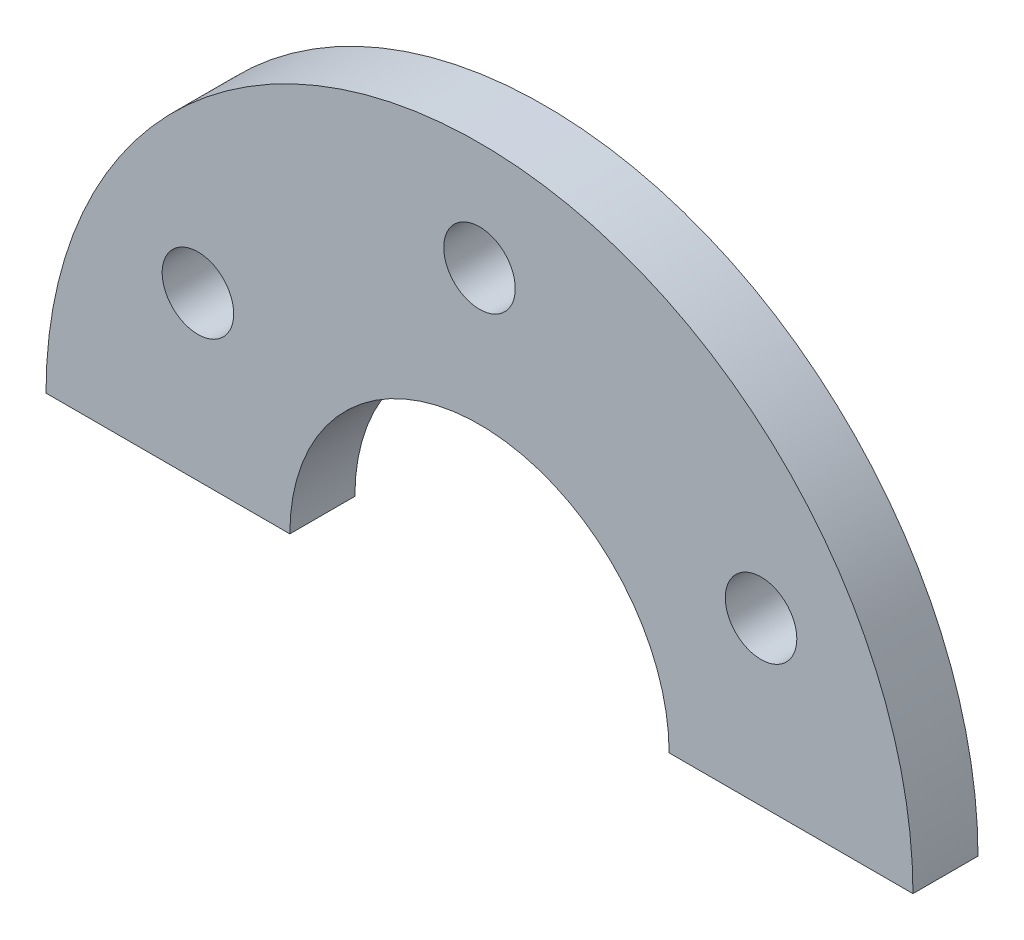
ISO-10303-21;
HEADER;
FILE_DESCRIPTION(('STEP AP214'),'2;1');
FILE_NAME('part.step','',(''),(''),'','','');
FILE_SCHEMA(('AUTOMOTIVE_DESIGN { 1 0 10303 214 1 1 1 1 }'));
ENDSEC;
DATA;
#1=APPLICATION_CONTEXT('core data for automotive mechanical design processes');
#2=APPLICATION_PROTOCOL_DEFINITION('international standard','automotive_design',2000,#1);
#3=PRODUCT_CONTEXT('',#1,'mechanical');
#4=PRODUCT('Part','Part','',(#3));
#5=PRODUCT_RELATED_PRODUCT_CATEGORY('part','',(#4));
#6=PRODUCT_DEFINITION_FORMATION('','',#4);
#7=PRODUCT_DEFINITION_CONTEXT('part definition',#1,'design');
#8=PRODUCT_DEFINITION('design','',#6,#7);
#9=PRODUCT_DEFINITION_SHAPE('','',#8);
#10=(LENGTH_UNIT() NAMED_UNIT(*) SI_UNIT(.MILLI.,.METRE.));
#11=(NAMED_UNIT(*) PLANE_ANGLE_UNIT() SI_UNIT($,.RADIAN.));
#12=(NAMED_UNIT(*) SI_UNIT($,.STERADIAN.) SOLID_ANGLE_UNIT());
#13=UNCERTAINTY_MEASURE_WITH_UNIT(LENGTH_MEASURE(1.E-05),#10,'distance_accuracy_value','');
#14=(GEOMETRIC_REPRESENTATION_CONTEXT(3) GLOBAL_UNCERTAINTY_ASSIGNED_CONTEXT((#13)) GLOBAL_UNIT_ASSIGNED_CONTEXT((#10,
#11,#12)) REPRESENTATION_CONTEXT('',''));
#15=CARTESIAN_POINT('',(0.,0.,0.));
#16=DIRECTION('',(0.,0.,1.));
#17=DIRECTION('',(1.,0.,0.));
#18=AXIS2_PLACEMENT_3D('',#15,#16,#17);
#19=CARTESIAN_POINT('',(0.,0.,-6.));
#20=DIRECTION('',(0.,0.,-1.));
#21=DIRECTION('',(1.,0.,0.));
#22=AXIS2_PLACEMENT_3D('',#19,#20,#21);
#23=PLANE('',#22);
#24=CARTESIAN_POINT('',(25.9807621135342,15.0000000000019,-6.));
#25=DIRECTION('',(0.,0.,1.));
#26=DIRECTION('',(1.,0.,0.));
#27=AXIS2_PLACEMENT_3D('',#24,#25,#26);
#28=CIRCLE('',#27,3.30000000000055);
#29=CARTESIAN_POINT('',(29.2807621135348,15.0000000000019,-6.));
#30=VERTEX_POINT('',#29);
#31=EDGE_CURVE('E114',#30,#30,#28,.T.);
#32=ORIENTED_EDGE('',*,*,#31,.T.);
#33=EDGE_LOOP('',(#32));
#34=FACE_BOUND('',#33,.T.);
#35=CARTESIAN_POINT('',(0.,0.,-6.));
#36=DIRECTION('',(0.,0.,1.));
#37=DIRECTION('',(1.,0.,0.));
#38=AXIS2_PLACEMENT_3D('',#35,#36,#37);
#39=CIRCLE('',#38,40.);
#40=CARTESIAN_POINT('',(40.,0.,-6.));
#41=VERTEX_POINT('',#40);
#42=CARTESIAN_POINT('',(-40.,0.,-6.));
#43=VERTEX_POINT('',#42);
#44=EDGE_CURVE('E91',#41,#43,#39,.T.);
#45=ORIENTED_EDGE('',*,*,#44,.F.);
#46=DIRECTION('',(1.,0.,0.));
#47=VECTOR('',#46,1.);
#48=CARTESIAN_POINT('',(17.5,0.,-6.));
#49=LINE('',#48,#47);
#50=CARTESIAN_POINT('',(17.5,0.,-6.));
#51=VERTEX_POINT('',#50);
#52=EDGE_CURVE('E94',#51,#41,#49,.T.);
#53=ORIENTED_EDGE('',*,*,#52,.F.);
#54=CARTESIAN_POINT('',(0.,0.,-6.));
#55=DIRECTION('',(0.,0.,-1.));
#56=DIRECTION('',(1.,0.,0.));
#57=AXIS2_PLACEMENT_3D('',#54,#55,#56);
#58=CIRCLE('',#57,17.5);
#59=CARTESIAN_POINT('',(-17.5,0.,-6.));
#60=VERTEX_POINT('',#59);
#61=EDGE_CURVE('E82',#60,#51,#58,.T.);
#62=ORIENTED_EDGE('',*,*,#61,.F.);
#63=DIRECTION('',(1.,0.,0.));
#64=VECTOR('',#63,1.);
#65=CARTESIAN_POINT('',(-40.,0.,-6.));
#66=LINE('',#65,#64);
#67=EDGE_CURVE('E87',#43,#60,#66,.T.);
#68=ORIENTED_EDGE('',*,*,#67,.F.);
#69=EDGE_LOOP('',(#45,#53,#62,#68));
#70=FACE_BOUND('',#69,.T.);
#71=CARTESIAN_POINT('',(0.,30.,-6.));
#72=DIRECTION('',(0.,0.,1.));
#73=DIRECTION('',(1.,0.,0.));
#74=AXIS2_PLACEMENT_3D('',#71,#72,#73);
#75=CIRCLE('',#74,3.3);
#76=CARTESIAN_POINT('',(3.3,30.,-6.));
#77=VERTEX_POINT('',#76);
#78=EDGE_CURVE('E103',#77,#77,#75,.T.);
#79=ORIENTED_EDGE('',*,*,#78,.T.);
#80=EDGE_LOOP('',(#79));
#81=FACE_BOUND('',#80,.T.);
#82=CARTESIAN_POINT('',(-25.9807621135321,14.9999999999981,-6.));
#83=DIRECTION('',(0.,0.,1.));
#84=DIRECTION('',(1.,0.,0.));
#85=AXIS2_PLACEMENT_3D('',#82,#83,#84);
#86=CIRCLE('',#85,3.30000000000191);
#87=CARTESIAN_POINT('',(-22.6807621135302,14.9999999999981,-6.));
#88=VERTEX_POINT('',#87);
#89=EDGE_CURVE('E120',#88,#88,#86,.T.);
#90=ORIENTED_EDGE('',*,*,#89,.T.);
#91=EDGE_LOOP('',(#90));
#92=FACE_BOUND('',#91,.T.);
#93=ADVANCED_FACE('F35',(#34,#70,#81,#92),#23,.T.);
#94=CARTESIAN_POINT('',(0.,0.,0.));
#95=DIRECTION('',(0.,0.,-1.));
#96=DIRECTION('',(1.,0.,0.));
#97=AXIS2_PLACEMENT_3D('',#94,#95,#96);
#98=PLANE('',#97);
#99=CARTESIAN_POINT('',(0.,0.,0.));
#100=DIRECTION('',(0.,0.,1.));
#101=DIRECTION('',(1.,0.,0.));
#102=AXIS2_PLACEMENT_3D('',#99,#100,#101);
#103=CIRCLE('',#102,40.);
#104=CARTESIAN_POINT('',(40.,0.,0.));
#105=VERTEX_POINT('',#104);
#106=CARTESIAN_POINT('',(-40.,0.,0.));
#107=VERTEX_POINT('',#106);
#108=EDGE_CURVE('E99',#105,#107,#103,.T.);
#109=ORIENTED_EDGE('',*,*,#108,.T.);
#110=DIRECTION('',(1.,0.,0.));
#111=VECTOR('',#110,1.);
#112=CARTESIAN_POINT('',(-40.,0.,0.));
#113=LINE('',#112,#111);
#114=CARTESIAN_POINT('',(-17.5,0.,0.));
#115=VERTEX_POINT('',#114);
#116=EDGE_CURVE('E102',#107,#115,#113,.T.);
#117=ORIENTED_EDGE('',*,*,#116,.T.);
#118=CARTESIAN_POINT('',(0.,0.,0.));
#119=DIRECTION('',(0.,0.,-1.));
#120=DIRECTION('',(1.,0.,0.));
#121=AXIS2_PLACEMENT_3D('',#118,#119,#120);
#122=CIRCLE('',#121,17.5);
#123=CARTESIAN_POINT('',(17.5,0.,0.));
#124=VERTEX_POINT('',#123);
#125=EDGE_CURVE('E85',#115,#124,#122,.T.);
#126=ORIENTED_EDGE('',*,*,#125,.T.);
#127=DIRECTION('',(1.,0.,0.));
#128=VECTOR('',#127,1.);
#129=CARTESIAN_POINT('',(17.5,0.,0.));
#130=LINE('',#129,#128);
#131=EDGE_CURVE('E106',#124,#105,#130,.T.);
#132=ORIENTED_EDGE('',*,*,#131,.T.);
#133=EDGE_LOOP('',(#109,#117,#126,#132));
#134=FACE_BOUND('',#133,.T.);
#135=CARTESIAN_POINT('',(0.,30.,0.));
#136=DIRECTION('',(0.,0.,1.));
#137=DIRECTION('',(1.,0.,0.));
#138=AXIS2_PLACEMENT_3D('',#135,#136,#137);
#139=CIRCLE('',#138,3.3);
#140=CARTESIAN_POINT('',(3.3,30.,0.));
#141=VERTEX_POINT('',#140);
#142=EDGE_CURVE('E111',#141,#141,#139,.T.);
#143=ORIENTED_EDGE('',*,*,#142,.F.);
#144=EDGE_LOOP('',(#143));
#145=FACE_BOUND('',#144,.T.);
#146=CARTESIAN_POINT('',(25.9807621135342,15.0000000000019,0.));
#147=DIRECTION('',(0.,0.,1.));
#148=DIRECTION('',(1.,0.,0.));
#149=AXIS2_PLACEMENT_3D('',#146,#147,#148);
#150=CIRCLE('',#149,3.30000000000055);
#151=CARTESIAN_POINT('',(29.2807621135348,15.0000000000019,0.));
#152=VERTEX_POINT('',#151);
#153=EDGE_CURVE('E117',#152,#152,#150,.T.);
#154=ORIENTED_EDGE('',*,*,#153,.F.);
#155=EDGE_LOOP('',(#154));
#156=FACE_BOUND('',#155,.T.);
#157=CARTESIAN_POINT('',(-25.9807621135321,14.9999999999981,0.));
#158=DIRECTION('',(0.,0.,1.));
#159=DIRECTION('',(1.,0.,0.));
#160=AXIS2_PLACEMENT_3D('',#157,#158,#159);
#161=CIRCLE('',#160,3.30000000000191);
#162=CARTESIAN_POINT('',(-22.6807621135302,14.9999999999981,0.));
#163=VERTEX_POINT('',#162);
#164=EDGE_CURVE('E123',#163,#163,#161,.T.);
#165=ORIENTED_EDGE('',*,*,#164,.F.);
#166=EDGE_LOOP('',(#165));
#167=FACE_BOUND('',#166,.T.);
#168=ADVANCED_FACE('F137',(#134,#145,#156,#167),#98,.F.);
#169=CARTESIAN_POINT('',(0.,0.,-6.));
#170=DIRECTION('',(0.,0.,1.));
#171=DIRECTION('',(-1.,0.,0.));
#172=AXIS2_PLACEMENT_3D('',#169,#170,#171);
#173=CYLINDRICAL_SURFACE('',#172,40.);
#174=ORIENTED_EDGE('',*,*,#108,.F.);
#175=DIRECTION('',(0.,0.,1.));
#176=VECTOR('',#175,1.);
#177=CARTESIAN_POINT('',(40.,0.,-6.));
#178=LINE('',#177,#176);
#179=EDGE_CURVE('E52',#41,#105,#178,.T.);
#180=ORIENTED_EDGE('',*,*,#179,.F.);
#181=ORIENTED_EDGE('',*,*,#44,.T.);
#182=DIRECTION('',(0.,0.,1.));
#183=VECTOR('',#182,1.);
#184=CARTESIAN_POINT('',(-40.,0.,-6.));
#185=LINE('',#184,#183);
#186=EDGE_CURVE('E11',#43,#107,#185,.T.);
#187=ORIENTED_EDGE('',*,*,#186,.T.);
#188=EDGE_LOOP('',(#174,#180,#181,#187));
#189=FACE_BOUND('',#188,.T.);
#190=ADVANCED_FACE('F37',(#189),#173,.T.);
#191=CARTESIAN_POINT('',(-40.,0.,-6.));
#192=DIRECTION('',(0.,1.,0.));
#193=DIRECTION('',(-1.,0.,0.));
#194=AXIS2_PLACEMENT_3D('',#191,#192,#193);
#195=PLANE('',#194);
#196=ORIENTED_EDGE('',*,*,#116,.F.);
#197=ORIENTED_EDGE('',*,*,#186,.F.);
#198=ORIENTED_EDGE('',*,*,#67,.T.);
#199=DIRECTION('',(0.,0.,1.));
#200=VECTOR('',#199,1.);
#201=CARTESIAN_POINT('',(-17.5,0.,-6.));
#202=LINE('',#201,#200);
#203=EDGE_CURVE('E44',#60,#115,#202,.T.);
#204=ORIENTED_EDGE('',*,*,#203,.T.);
#205=EDGE_LOOP('',(#196,#197,#198,#204));
#206=FACE_BOUND('',#205,.T.);
#207=ADVANCED_FACE('F88',(#206),#195,.F.);
#208=CARTESIAN_POINT('',(0.,0.,-6.));
#209=DIRECTION('',(0.,0.,1.));
#210=DIRECTION('',(-1.,0.,0.));
#211=AXIS2_PLACEMENT_3D('',#208,#209,#210);
#212=CYLINDRICAL_SURFACE('',#211,17.5);
#213=ORIENTED_EDGE('',*,*,#125,.F.);
#214=ORIENTED_EDGE('',*,*,#203,.F.);
#215=ORIENTED_EDGE('',*,*,#61,.T.);
#216=DIRECTION('',(0.,0.,1.));
#217=VECTOR('',#216,1.);
#218=CARTESIAN_POINT('',(17.5,0.,-6.));
#219=LINE('',#218,#217);
#220=EDGE_CURVE('E68',#51,#124,#219,.T.);
#221=ORIENTED_EDGE('',*,*,#220,.T.);
#222=EDGE_LOOP('',(#213,#214,#215,#221));
#223=FACE_BOUND('',#222,.T.);
#224=ADVANCED_FACE('F80',(#223),#212,.F.);
#225=CARTESIAN_POINT('',(17.5,0.,-6.));
#226=DIRECTION('',(0.,1.,0.));
#227=DIRECTION('',(-1.,0.,0.));
#228=AXIS2_PLACEMENT_3D('',#225,#226,#227);
#229=PLANE('',#228);
#230=ORIENTED_EDGE('',*,*,#131,.F.);
#231=ORIENTED_EDGE('',*,*,#220,.F.);
#232=ORIENTED_EDGE('',*,*,#52,.T.);
#233=ORIENTED_EDGE('',*,*,#179,.T.);
#234=EDGE_LOOP('',(#230,#231,#232,#233));
#235=FACE_BOUND('',#234,.T.);
#236=ADVANCED_FACE('F149',(#235),#229,.F.);
#237=CARTESIAN_POINT('',(0.,30.,-6.));
#238=DIRECTION('',(0.,0.,1.));
#239=DIRECTION('',(-1.,0.,0.));
#240=AXIS2_PLACEMENT_3D('',#237,#238,#239);
#241=CYLINDRICAL_SURFACE('',#240,3.3);
#242=ORIENTED_EDGE('',*,*,#78,.F.);
#243=EDGE_LOOP('',(#242));
#244=FACE_BOUND('',#243,.T.);
#245=ORIENTED_EDGE('',*,*,#142,.T.);
#246=EDGE_LOOP('',(#245));
#247=FACE_BOUND('',#246,.T.);
#248=ADVANCED_FACE('F152',(#244,#247),#241,.F.);
#249=CARTESIAN_POINT('',(25.9807621135342,15.0000000000019,-6.));
#250=DIRECTION('',(0.,0.,1.));
#251=DIRECTION('',(-1.,0.,0.));
#252=AXIS2_PLACEMENT_3D('',#249,#250,#251);
#253=CYLINDRICAL_SURFACE('',#252,3.30000000000055);
#254=ORIENTED_EDGE('',*,*,#31,.F.);
#255=EDGE_LOOP('',(#254));
#256=FACE_BOUND('',#255,.T.);
#257=ORIENTED_EDGE('',*,*,#153,.T.);
#258=EDGE_LOOP('',(#257));
#259=FACE_BOUND('',#258,.T.);
#260=ADVANCED_FACE('F133',(#256,#259),#253,.F.);
#261=CARTESIAN_POINT('',(-25.9807621135321,14.9999999999981,-6.));
#262=DIRECTION('',(0.,0.,1.));
#263=DIRECTION('',(-1.,0.,0.));
#264=AXIS2_PLACEMENT_3D('',#261,#262,#263);
#265=CYLINDRICAL_SURFACE('',#264,3.30000000000191);
#266=ORIENTED_EDGE('',*,*,#89,.F.);
#267=EDGE_LOOP('',(#266));
#268=FACE_BOUND('',#267,.T.);
#269=ORIENTED_EDGE('',*,*,#164,.T.);
#270=EDGE_LOOP('',(#269));
#271=FACE_BOUND('',#270,.T.);
#272=ADVANCED_FACE('F130',(#268,#271),#265,.F.);
#273=CLOSED_SHELL('',(#93,#168,#190,#207,#224,#236,#248,#260,#272));
#274=MANIFOLD_SOLID_BREP('B2',#273);
#275=ADVANCED_BREP_SHAPE_REPRESENTATION('',(#18,#274),#14);
#276=SHAPE_DEFINITION_REPRESENTATION(#9,#275);
ENDSEC;
END-ISO-10303-21;
